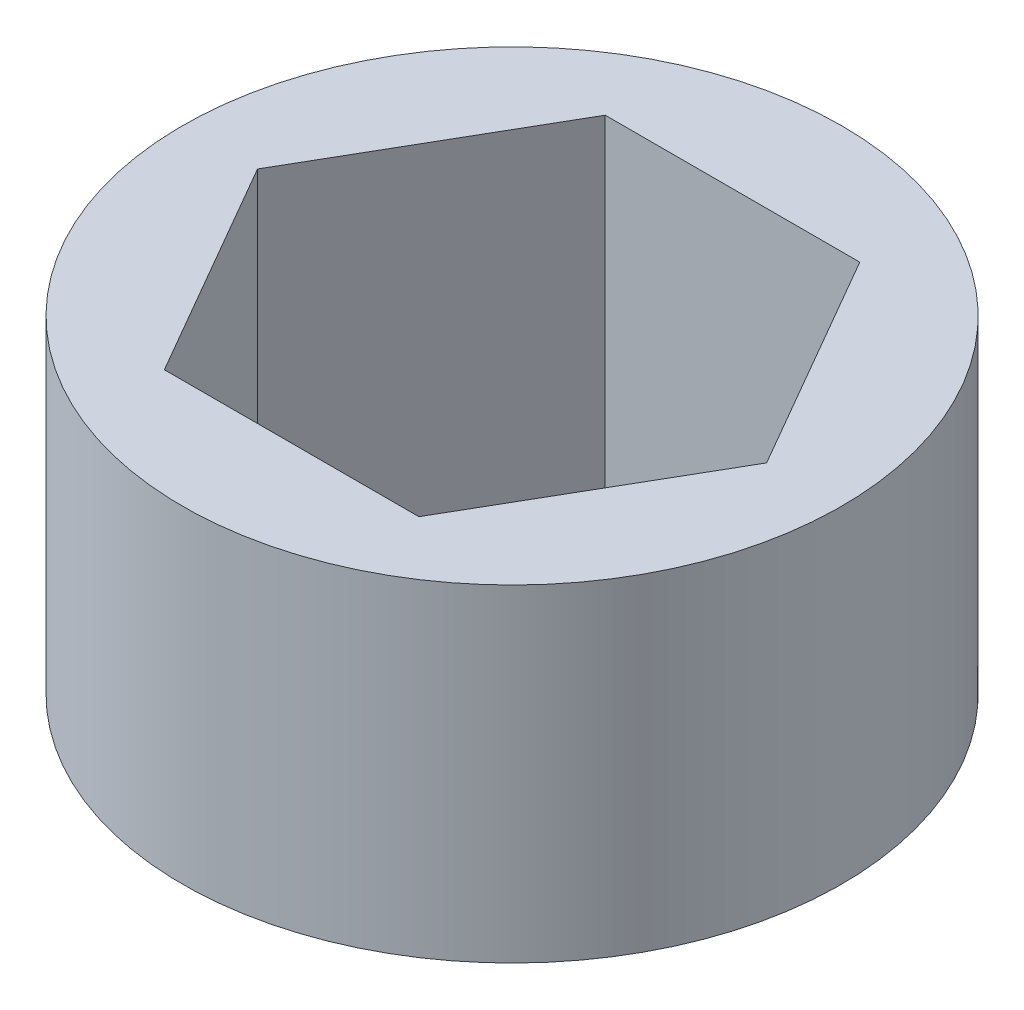
ISO-10303-21;
HEADER;
FILE_DESCRIPTION(('STEP AP214'),'2;1');
FILE_NAME('part.step','',(''),(''),'','','');
FILE_SCHEMA(('AUTOMOTIVE_DESIGN { 1 0 10303 214 1 1 1 1 }'));
ENDSEC;
DATA;
#1=APPLICATION_CONTEXT('core data for automotive mechanical design processes');
#2=APPLICATION_PROTOCOL_DEFINITION('international standard','automotive_design',2000,#1);
#3=PRODUCT_CONTEXT('',#1,'mechanical');
#4=PRODUCT('Part','Part','',(#3));
#5=PRODUCT_RELATED_PRODUCT_CATEGORY('part','',(#4));
#6=PRODUCT_DEFINITION_FORMATION('','',#4);
#7=PRODUCT_DEFINITION_CONTEXT('part definition',#1,'design');
#8=PRODUCT_DEFINITION('design','',#6,#7);
#9=PRODUCT_DEFINITION_SHAPE('','',#8);
#10=(LENGTH_UNIT() NAMED_UNIT(*) SI_UNIT(.MILLI.,.METRE.));
#11=(NAMED_UNIT(*) PLANE_ANGLE_UNIT() SI_UNIT($,.RADIAN.));
#12=(NAMED_UNIT(*) SI_UNIT($,.STERADIAN.) SOLID_ANGLE_UNIT());
#13=UNCERTAINTY_MEASURE_WITH_UNIT(LENGTH_MEASURE(1.E-05),#10,'distance_accuracy_value','');
#14=(GEOMETRIC_REPRESENTATION_CONTEXT(3) GLOBAL_UNCERTAINTY_ASSIGNED_CONTEXT((#13)) GLOBAL_UNIT_ASSIGNED_CONTEXT((#10,
#11,#12)) REPRESENTATION_CONTEXT('',''));
#15=CARTESIAN_POINT('',(0.,0.,0.));
#16=DIRECTION('',(0.,0.,1.));
#17=DIRECTION('',(1.,0.,0.));
#18=AXIS2_PLACEMENT_3D('',#15,#16,#17);
#19=CARTESIAN_POINT('',(0.,9.525,0.));
#20=DIRECTION('',(0.,1.,0.));
#21=DIRECTION('',(0.,0.,1.));
#22=AXIS2_PLACEMENT_3D('',#19,#20,#21);
#23=PLANE('',#22);
#24=CARTESIAN_POINT('',(0.,9.525,0.));
#25=DIRECTION('',(0.,1.,0.));
#26=DIRECTION('',(0.,0.,1.));
#27=AXIS2_PLACEMENT_3D('',#24,#25,#26);
#28=CIRCLE('',#27,9.5885);
#29=CARTESIAN_POINT('',(0.,9.525,-9.5885));
#30=VERTEX_POINT('',#29);
#31=EDGE_CURVE('E11',#30,#30,#28,.T.);
#32=ORIENTED_EDGE('',*,*,#31,.T.);
#33=EDGE_LOOP('',(#32));
#34=FACE_BOUND('',#33,.T.);
#35=DIRECTION('',(-1.,0.,0.));
#36=VECTOR('',#35,1.);
#37=CARTESIAN_POINT('',(3.70283595144766,9.525,-6.4135));
#38=LINE('',#37,#36);
#39=CARTESIAN_POINT('',(3.70283595144766,9.525,-6.4135));
#40=VERTEX_POINT('',#39);
#41=CARTESIAN_POINT('',(-3.70283595144767,9.525,-6.4135));
#42=VERTEX_POINT('',#41);
#43=EDGE_CURVE('E102',#40,#42,#38,.T.);
#44=ORIENTED_EDGE('',*,*,#43,.F.);
#45=DIRECTION('',(-0.5,0.,-0.866025403784439));
#46=VECTOR('',#45,1.);
#47=CARTESIAN_POINT('',(7.40567190289533,9.525,0.));
#48=LINE('',#47,#46);
#49=CARTESIAN_POINT('',(7.40567190289533,9.525,0.));
#50=VERTEX_POINT('',#49);
#51=EDGE_CURVE('E94',#50,#40,#48,.T.);
#52=ORIENTED_EDGE('',*,*,#51,.F.);
#53=DIRECTION('',(0.5,0.,-0.866025403784439));
#54=VECTOR('',#53,1.);
#55=CARTESIAN_POINT('',(3.70283595144766,9.525,6.4135));
#56=LINE('',#55,#54);
#57=CARTESIAN_POINT('',(3.70283595144767,9.525,6.4135));
#58=VERTEX_POINT('',#57);
#59=EDGE_CURVE('E122',#58,#50,#56,.T.);
#60=ORIENTED_EDGE('',*,*,#59,.F.);
#61=DIRECTION('',(1.,0.,0.));
#62=VECTOR('',#61,1.);
#63=CARTESIAN_POINT('',(-3.70283595144766,9.525,6.4135));
#64=LINE('',#63,#62);
#65=CARTESIAN_POINT('',(-3.70283595144766,9.525,6.4135));
#66=VERTEX_POINT('',#65);
#67=EDGE_CURVE('E120',#66,#58,#64,.T.);
#68=ORIENTED_EDGE('',*,*,#67,.F.);
#69=DIRECTION('',(0.5,0.,0.866025403784438));
#70=VECTOR('',#69,1.);
#71=CARTESIAN_POINT('',(-7.40567190289533,9.525,0.));
#72=LINE('',#71,#70);
#73=CARTESIAN_POINT('',(-7.40567190289533,9.525,0.));
#74=VERTEX_POINT('',#73);
#75=EDGE_CURVE('E116',#74,#66,#72,.T.);
#76=ORIENTED_EDGE('',*,*,#75,.F.);
#77=DIRECTION('',(-0.5,0.,0.866025403784439));
#78=VECTOR('',#77,1.);
#79=CARTESIAN_POINT('',(-3.70283595144767,9.525,-6.4135));
#80=LINE('',#79,#78);
#81=EDGE_CURVE('E114',#42,#74,#80,.T.);
#82=ORIENTED_EDGE('',*,*,#81,.F.);
#83=EDGE_LOOP('',(#44,#52,#60,#68,#76,#82));
#84=FACE_BOUND('',#83,.T.);
#85=ADVANCED_FACE('F41',(#34,#84),#23,.T.);
#86=CARTESIAN_POINT('',(0.,0.,0.));
#87=DIRECTION('',(0.,1.,0.));
#88=DIRECTION('',(0.,0.,1.));
#89=AXIS2_PLACEMENT_3D('',#86,#87,#88);
#90=PLANE('',#89);
#91=CARTESIAN_POINT('',(0.,0.,0.));
#92=DIRECTION('',(0.,1.,0.));
#93=DIRECTION('',(0.,0.,1.));
#94=AXIS2_PLACEMENT_3D('',#91,#92,#93);
#95=CIRCLE('',#94,9.5885);
#96=CARTESIAN_POINT('',(0.,0.,-9.5885));
#97=VERTEX_POINT('',#96);
#98=EDGE_CURVE('E45',#97,#97,#95,.T.);
#99=ORIENTED_EDGE('',*,*,#98,.F.);
#100=EDGE_LOOP('',(#99));
#101=FACE_BOUND('',#100,.T.);
#102=DIRECTION('',(-0.5,0.,-0.866025403784439));
#103=VECTOR('',#102,1.);
#104=CARTESIAN_POINT('',(7.40567190289533,0.,0.));
#105=LINE('',#104,#103);
#106=CARTESIAN_POINT('',(7.40567190289533,0.,0.));
#107=VERTEX_POINT('',#106);
#108=CARTESIAN_POINT('',(3.70283595144766,0.,-6.4135));
#109=VERTEX_POINT('',#108);
#110=EDGE_CURVE('E64',#107,#109,#105,.T.);
#111=ORIENTED_EDGE('',*,*,#110,.T.);
#112=DIRECTION('',(-1.,0.,0.));
#113=VECTOR('',#112,1.);
#114=CARTESIAN_POINT('',(3.70283595144766,0.,-6.4135));
#115=LINE('',#114,#113);
#116=CARTESIAN_POINT('',(-3.70283595144767,0.,-6.4135));
#117=VERTEX_POINT('',#116);
#118=EDGE_CURVE('E109',#109,#117,#115,.T.);
#119=ORIENTED_EDGE('',*,*,#118,.T.);
#120=DIRECTION('',(-0.5,0.,0.866025403784439));
#121=VECTOR('',#120,1.);
#122=CARTESIAN_POINT('',(-3.70283595144767,0.,-6.4135));
#123=LINE('',#122,#121);
#124=CARTESIAN_POINT('',(-7.40567190289533,0.,0.));
#125=VERTEX_POINT('',#124);
#126=EDGE_CURVE('E126',#117,#125,#123,.T.);
#127=ORIENTED_EDGE('',*,*,#126,.T.);
#128=DIRECTION('',(0.5,0.,0.866025403784438));
#129=VECTOR('',#128,1.);
#130=CARTESIAN_POINT('',(-7.40567190289533,0.,0.));
#131=LINE('',#130,#129);
#132=CARTESIAN_POINT('',(-3.70283595144766,0.,6.4135));
#133=VERTEX_POINT('',#132);
#134=EDGE_CURVE('E129',#125,#133,#131,.T.);
#135=ORIENTED_EDGE('',*,*,#134,.T.);
#136=DIRECTION('',(1.,0.,0.));
#137=VECTOR('',#136,1.);
#138=CARTESIAN_POINT('',(-3.70283595144766,0.,6.4135));
#139=LINE('',#138,#137);
#140=CARTESIAN_POINT('',(3.70283595144766,0.,6.4135));
#141=VERTEX_POINT('',#140);
#142=EDGE_CURVE('E132',#133,#141,#139,.T.);
#143=ORIENTED_EDGE('',*,*,#142,.T.);
#144=DIRECTION('',(0.5,0.,-0.866025403784439));
#145=VECTOR('',#144,1.);
#146=CARTESIAN_POINT('',(3.70283595144766,0.,6.4135));
#147=LINE('',#146,#145);
#148=EDGE_CURVE('E103',#141,#107,#147,.T.);
#149=ORIENTED_EDGE('',*,*,#148,.T.);
#150=EDGE_LOOP('',(#111,#119,#127,#135,#143,#149));
#151=FACE_BOUND('',#150,.T.);
#152=ADVANCED_FACE('F149',(#101,#151),#90,.F.);
#153=CARTESIAN_POINT('',(0.,9.525,0.));
#154=DIRECTION('',(0.,-1.,0.));
#155=DIRECTION('',(0.,0.,-1.));
#156=AXIS2_PLACEMENT_3D('',#153,#154,#155);
#157=CYLINDRICAL_SURFACE('',#156,9.5885);
#158=CARTESIAN_POINT('',(0.,9.525,-9.5885));
#159=CARTESIAN_POINT('',(0.,9.42578125,-9.5885));
#160=CARTESIAN_POINT('',(0.,9.3265625,-9.5885));
#161=CARTESIAN_POINT('',(0.,9.128125,-9.5885));
#162=CARTESIAN_POINT('',(0.,9.02890625,-9.5885));
#163=CARTESIAN_POINT('',(0.,8.83046875,-9.5885));
#164=CARTESIAN_POINT('',(0.,8.73125,-9.5885));
#165=CARTESIAN_POINT('',(0.,8.5328125,-9.5885));
#166=CARTESIAN_POINT('',(0.,8.43359375,-9.5885));
#167=CARTESIAN_POINT('',(0.,8.23515625,-9.5885));
#168=CARTESIAN_POINT('',(0.,8.1359375,-9.5885));
#169=CARTESIAN_POINT('',(0.,7.9375,-9.5885));
#170=CARTESIAN_POINT('',(0.,7.83828125,-9.5885));
#171=CARTESIAN_POINT('',(0.,7.63984375,-9.5885));
#172=CARTESIAN_POINT('',(0.,7.540625,-9.5885));
#173=CARTESIAN_POINT('',(0.,7.3421875,-9.5885));
#174=CARTESIAN_POINT('',(0.,7.24296875,-9.5885));
#175=CARTESIAN_POINT('',(0.,7.04453125,-9.5885));
#176=CARTESIAN_POINT('',(0.,6.9453125,-9.5885));
#177=CARTESIAN_POINT('',(0.,6.746875,-9.5885));
#178=CARTESIAN_POINT('',(0.,6.64765625,-9.5885));
#179=CARTESIAN_POINT('',(0.,6.44921875,-9.5885));
#180=CARTESIAN_POINT('',(0.,6.35,-9.5885));
#181=CARTESIAN_POINT('',(0.,6.1515625,-9.5885));
#182=CARTESIAN_POINT('',(0.,6.05234375,-9.5885));
#183=CARTESIAN_POINT('',(0.,5.85390625,-9.5885));
#184=CARTESIAN_POINT('',(0.,5.7546875,-9.5885));
#185=CARTESIAN_POINT('',(0.,5.55625,-9.5885));
#186=CARTESIAN_POINT('',(0.,5.45703125,-9.5885));
#187=CARTESIAN_POINT('',(0.,5.25859375,-9.5885));
#188=CARTESIAN_POINT('',(0.,5.159375,-9.5885));
#189=CARTESIAN_POINT('',(0.,4.9609375,-9.5885));
#190=CARTESIAN_POINT('',(0.,4.86171875,-9.5885));
#191=CARTESIAN_POINT('',(0.,4.66328125,-9.5885));
#192=CARTESIAN_POINT('',(0.,4.5640625,-9.5885));
#193=CARTESIAN_POINT('',(0.,4.365625,-9.5885));
#194=CARTESIAN_POINT('',(0.,4.26640625,-9.5885));
#195=CARTESIAN_POINT('',(0.,4.06796875,-9.5885));
#196=CARTESIAN_POINT('',(0.,3.96875,-9.5885));
#197=CARTESIAN_POINT('',(0.,3.7703125,-9.5885));
#198=CARTESIAN_POINT('',(0.,3.67109375,-9.5885));
#199=CARTESIAN_POINT('',(0.,3.47265625,-9.5885));
#200=CARTESIAN_POINT('',(0.,3.3734375,-9.5885));
#201=CARTESIAN_POINT('',(0.,3.175,-9.5885));
#202=CARTESIAN_POINT('',(0.,3.07578125,-9.5885));
#203=CARTESIAN_POINT('',(0.,2.87734375,-9.5885));
#204=CARTESIAN_POINT('',(0.,2.778125,-9.5885));
#205=CARTESIAN_POINT('',(0.,2.5796875,-9.5885));
#206=CARTESIAN_POINT('',(0.,2.48046875,-9.5885));
#207=CARTESIAN_POINT('',(0.,2.28203125,-9.5885));
#208=CARTESIAN_POINT('',(0.,2.1828125,-9.5885));
#209=CARTESIAN_POINT('',(0.,1.984375,-9.5885));
#210=CARTESIAN_POINT('',(0.,1.88515625,-9.5885));
#211=CARTESIAN_POINT('',(0.,1.68671875,-9.5885));
#212=CARTESIAN_POINT('',(0.,1.5875,-9.5885));
#213=CARTESIAN_POINT('',(0.,1.3890625,-9.5885));
#214=CARTESIAN_POINT('',(0.,1.28984375,-9.5885));
#215=CARTESIAN_POINT('',(0.,1.09140625,-9.5885));
#216=CARTESIAN_POINT('',(0.,0.992187500000001,-9.5885));
#217=CARTESIAN_POINT('',(0.,0.793750000000001,-9.5885));
#218=CARTESIAN_POINT('',(0.,0.69453125,-9.5885));
#219=CARTESIAN_POINT('',(0.,0.49609375,-9.5885));
#220=CARTESIAN_POINT('',(0.,0.396875,-9.5885));
#221=CARTESIAN_POINT('',(0.,0.1984375,-9.5885));
#222=CARTESIAN_POINT('',(0.,0.0992187500000001,-9.5885));
#223=CARTESIAN_POINT('',(0.,0.,-9.5885));
#224=B_SPLINE_CURVE_WITH_KNOTS('',3,(#158,#159,#160,#161,#162,#163,#164,#165,#166,#167,#168,
#169,#170,#171,#172,#173,#174,#175,#176,#177,#178,#179,#180,#181,#182,#183,#184,#185,#186,#187,
#188,#189,#190,#191,#192,#193,#194,#195,#196,#197,#198,#199,#200,#201,#202,#203,#204,#205,#206,
#207,#208,#209,#210,#211,#212,#213,#214,#215,#216,#217,#218,#219,#220,#221,#222,#223),
.UNSPECIFIED.,.F.,.F.,(4,2,2,2,2,2,2,2,2,2,2,2,2,2,2,2,2,2,2,2,2,2,2,2,2,2,2,2,2,2,2,2,4),(0.,
0.29765625,0.5953125,0.892968750000001,1.190625,1.48828125,1.7859375,2.08359375,2.38125,
2.67890625,2.9765625,3.27421875,3.571875,3.86953125,4.1671875,4.46484375,4.7625,5.06015625,
5.3578125,5.65546875,5.953125,6.25078125,6.5484375,6.84609375,7.14375,7.44140625,7.7390625,
8.03671875,8.334375,8.63203125,8.9296875,9.22734375,9.525),.UNSPECIFIED.);
#225=EDGE_CURVE('BSEAM43',#30,#97,#224,.T.);
#226=ORIENTED_EDGE('',*,*,#31,.F.);
#227=ORIENTED_EDGE('',*,*,#98,.T.);
#228=ORIENTED_EDGE('',*,*,#225,.T.);
#229=ORIENTED_EDGE('',*,*,#225,.F.);
#230=EDGE_LOOP('',(#226,#228,#227,#229));
#231=FACE_BOUND('',#230,.T.);
#232=ADVANCED_FACE('F43',(#231),#157,.T.);
#233=CARTESIAN_POINT('',(7.40567190289533,9.525,0.));
#234=DIRECTION('',(-0.866025403784439,0.,0.5));
#235=DIRECTION('',(0.5,0.,0.866025403784439));
#236=AXIS2_PLACEMENT_3D('',#233,#234,#235);
#237=PLANE('',#236);
#238=ORIENTED_EDGE('',*,*,#110,.F.);
#239=DIRECTION('',(0.,-1.,0.));
#240=VECTOR('',#239,1.);
#241=CARTESIAN_POINT('',(7.40567190289533,9.525,0.));
#242=LINE('',#241,#240);
#243=EDGE_CURVE('E98',#50,#107,#242,.T.);
#244=ORIENTED_EDGE('',*,*,#243,.F.);
#245=ORIENTED_EDGE('',*,*,#51,.T.);
#246=DIRECTION('',(0.,-1.,0.));
#247=VECTOR('',#246,1.);
#248=CARTESIAN_POINT('',(3.70283595144766,9.525,-6.4135));
#249=LINE('',#248,#247);
#250=EDGE_CURVE('E97',#40,#109,#249,.T.);
#251=ORIENTED_EDGE('',*,*,#250,.T.);
#252=EDGE_LOOP('',(#238,#244,#245,#251));
#253=FACE_BOUND('',#252,.T.);
#254=ADVANCED_FACE('F96',(#253),#237,.T.);
#255=CARTESIAN_POINT('',(3.70283595144766,9.525,-6.4135));
#256=DIRECTION('',(0.,0.,1.));
#257=DIRECTION('',(1.,0.,0.));
#258=AXIS2_PLACEMENT_3D('',#255,#256,#257);
#259=PLANE('',#258);
#260=ORIENTED_EDGE('',*,*,#118,.F.);
#261=ORIENTED_EDGE('',*,*,#250,.F.);
#262=ORIENTED_EDGE('',*,*,#43,.T.);
#263=DIRECTION('',(0.,-1.,0.));
#264=VECTOR('',#263,1.);
#265=CARTESIAN_POINT('',(-3.70283595144767,9.525,-6.4135));
#266=LINE('',#265,#264);
#267=EDGE_CURVE('E110',#42,#117,#266,.T.);
#268=ORIENTED_EDGE('',*,*,#267,.T.);
#269=EDGE_LOOP('',(#260,#261,#262,#268));
#270=FACE_BOUND('',#269,.T.);
#271=ADVANCED_FACE('F106',(#270),#259,.T.);
#272=CARTESIAN_POINT('',(-3.70283595144767,9.525,-6.4135));
#273=DIRECTION('',(0.866025403784439,0.,0.5));
#274=DIRECTION('',(0.5,0.,-0.866025403784439));
#275=AXIS2_PLACEMENT_3D('',#272,#273,#274);
#276=PLANE('',#275);
#277=ORIENTED_EDGE('',*,*,#126,.F.);
#278=ORIENTED_EDGE('',*,*,#267,.F.);
#279=ORIENTED_EDGE('',*,*,#81,.T.);
#280=DIRECTION('',(0.,-1.,0.));
#281=VECTOR('',#280,1.);
#282=CARTESIAN_POINT('',(-7.40567190289533,9.525,0.));
#283=LINE('',#282,#281);
#284=EDGE_CURVE('E141',#74,#125,#283,.T.);
#285=ORIENTED_EDGE('',*,*,#284,.T.);
#286=EDGE_LOOP('',(#277,#278,#279,#285));
#287=FACE_BOUND('',#286,.T.);
#288=ADVANCED_FACE('F145',(#287),#276,.T.);
#289=CARTESIAN_POINT('',(-7.40567190289533,9.525,0.));
#290=DIRECTION('',(0.866025403784439,0.,-0.5));
#291=DIRECTION('',(-0.5,0.,-0.866025403784438));
#292=AXIS2_PLACEMENT_3D('',#289,#290,#291);
#293=PLANE('',#292);
#294=ORIENTED_EDGE('',*,*,#134,.F.);
#295=ORIENTED_EDGE('',*,*,#284,.F.);
#296=ORIENTED_EDGE('',*,*,#75,.T.);
#297=DIRECTION('',(0.,-1.,0.));
#298=VECTOR('',#297,1.);
#299=CARTESIAN_POINT('',(-3.70283595144766,9.525,6.4135));
#300=LINE('',#299,#298);
#301=EDGE_CURVE('E139',#66,#133,#300,.T.);
#302=ORIENTED_EDGE('',*,*,#301,.T.);
#303=EDGE_LOOP('',(#294,#295,#296,#302));
#304=FACE_BOUND('',#303,.T.);
#305=ADVANCED_FACE('F157',(#304),#293,.T.);
#306=CARTESIAN_POINT('',(-3.70283595144766,9.525,6.4135));
#307=DIRECTION('',(0.,0.,-1.));
#308=DIRECTION('',(-1.,0.,0.));
#309=AXIS2_PLACEMENT_3D('',#306,#307,#308);
#310=PLANE('',#309);
#311=ORIENTED_EDGE('',*,*,#142,.F.);
#312=ORIENTED_EDGE('',*,*,#301,.F.);
#313=ORIENTED_EDGE('',*,*,#67,.T.);
#314=DIRECTION('',(0.,-1.,0.));
#315=VECTOR('',#314,1.);
#316=CARTESIAN_POINT('',(3.70283595144766,9.525,6.4135));
#317=LINE('',#316,#315);
#318=EDGE_CURVE('E56',#58,#141,#317,.T.);
#319=ORIENTED_EDGE('',*,*,#318,.T.);
#320=EDGE_LOOP('',(#311,#312,#313,#319));
#321=FACE_BOUND('',#320,.T.);
#322=ADVANCED_FACE('F155',(#321),#310,.T.);
#323=CARTESIAN_POINT('',(3.70283595144766,9.525,6.4135));
#324=DIRECTION('',(-0.866025403784439,0.,-0.5));
#325=DIRECTION('',(-0.5,0.,0.866025403784439));
#326=AXIS2_PLACEMENT_3D('',#323,#324,#325);
#327=PLANE('',#326);
#328=ORIENTED_EDGE('',*,*,#148,.F.);
#329=ORIENTED_EDGE('',*,*,#318,.F.);
#330=ORIENTED_EDGE('',*,*,#59,.T.);
#331=ORIENTED_EDGE('',*,*,#243,.T.);
#332=EDGE_LOOP('',(#328,#329,#330,#331));
#333=FACE_BOUND('',#332,.T.);
#334=ADVANCED_FACE('F151',(#333),#327,.T.);
#335=CLOSED_SHELL('',(#85,#152,#232,#254,#271,#288,#305,#322,#334));
#336=MANIFOLD_SOLID_BREP('B2',#335);
#337=ADVANCED_BREP_SHAPE_REPRESENTATION('',(#18,#336),#14);
#338=SHAPE_DEFINITION_REPRESENTATION(#9,#337);
ENDSEC;
END-ISO-10303-21;
